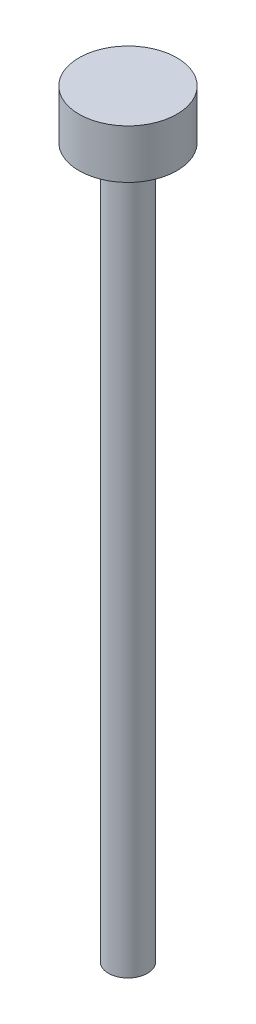
ISO-10303-21;
HEADER;
FILE_DESCRIPTION(('STEP AP214'),'2;1');
FILE_NAME('part.step','',(''),(''),'','','');
FILE_SCHEMA(('AUTOMOTIVE_DESIGN { 1 0 10303 214 1 1 1 1 }'));
ENDSEC;
DATA;
#1=APPLICATION_CONTEXT('core data for automotive mechanical design processes');
#2=APPLICATION_PROTOCOL_DEFINITION('international standard','automotive_design',2000,#1);
#3=PRODUCT_CONTEXT('',#1,'mechanical');
#4=PRODUCT('Part','Part','',(#3));
#5=PRODUCT_RELATED_PRODUCT_CATEGORY('part','',(#4));
#6=PRODUCT_DEFINITION_FORMATION('','',#4);
#7=PRODUCT_DEFINITION_CONTEXT('part definition',#1,'design');
#8=PRODUCT_DEFINITION('design','',#6,#7);
#9=PRODUCT_DEFINITION_SHAPE('','',#8);
#10=(LENGTH_UNIT() NAMED_UNIT(*) SI_UNIT(.MILLI.,.METRE.));
#11=(NAMED_UNIT(*) PLANE_ANGLE_UNIT() SI_UNIT($,.RADIAN.));
#12=(NAMED_UNIT(*) SI_UNIT($,.STERADIAN.) SOLID_ANGLE_UNIT());
#13=UNCERTAINTY_MEASURE_WITH_UNIT(LENGTH_MEASURE(1.E-05),#10,'distance_accuracy_value','');
#14=(GEOMETRIC_REPRESENTATION_CONTEXT(3) GLOBAL_UNCERTAINTY_ASSIGNED_CONTEXT((#13)) GLOBAL_UNIT_ASSIGNED_CONTEXT((#10,
#11,#12)) REPRESENTATION_CONTEXT('',''));
#15=CARTESIAN_POINT('',(0.,0.,0.));
#16=DIRECTION('',(0.,0.,1.));
#17=DIRECTION('',(1.,0.,0.));
#18=AXIS2_PLACEMENT_3D('',#15,#16,#17);
#19=CARTESIAN_POINT('',(0.,73.66,0.));
#20=DIRECTION('',(0.,-1.,0.));
#21=DIRECTION('',(0.,0.,-1.));
#22=AXIS2_PLACEMENT_3D('',#19,#20,#21);
#23=CYLINDRICAL_SURFACE('',#22,2.032);
#24=CARTESIAN_POINT('',(0.,73.66,0.));
#25=DIRECTION('',(0.,1.,0.));
#26=DIRECTION('',(0.,0.,1.));
#27=AXIS2_PLACEMENT_3D('',#24,#25,#26);
#28=CIRCLE('',#27,2.032);
#29=CARTESIAN_POINT('',(0.,73.66,2.032));
#30=VERTEX_POINT('',#29);
#31=EDGE_CURVE('E10',#30,#30,#28,.T.);
#32=ORIENTED_EDGE('',*,*,#31,.F.);
#33=EDGE_LOOP('',(#32));
#34=FACE_BOUND('',#33,.T.);
#35=CARTESIAN_POINT('',(0.,0.,0.));
#36=DIRECTION('',(0.,1.,0.));
#37=DIRECTION('',(0.,0.,1.));
#38=AXIS2_PLACEMENT_3D('',#35,#36,#37);
#39=CIRCLE('',#38,2.032);
#40=CARTESIAN_POINT('',(0.,0.,2.032));
#41=VERTEX_POINT('',#40);
#42=EDGE_CURVE('E34',#41,#41,#39,.T.);
#43=ORIENTED_EDGE('',*,*,#42,.T.);
#44=EDGE_LOOP('',(#43));
#45=FACE_BOUND('',#44,.T.);
#46=ADVANCED_FACE('F31',(#34,#45),#23,.T.);
#47=CARTESIAN_POINT('',(0.,0.,0.));
#48=DIRECTION('',(0.,1.,0.));
#49=DIRECTION('',(0.,0.,1.));
#50=AXIS2_PLACEMENT_3D('',#47,#48,#49);
#51=PLANE('',#50);
#52=ORIENTED_EDGE('',*,*,#42,.F.);
#53=EDGE_LOOP('',(#52));
#54=FACE_BOUND('',#53,.T.);
#55=ADVANCED_FACE('F59',(#54),#51,.F.);
#56=CARTESIAN_POINT('',(0.,73.66,0.));
#57=DIRECTION('',(0.,1.,0.));
#58=DIRECTION('',(0.,0.,1.));
#59=AXIS2_PLACEMENT_3D('',#56,#57,#58);
#60=PLANE('',#59);
#61=CARTESIAN_POINT('',(0.,73.66,0.));
#62=DIRECTION('',(0.,1.,0.));
#63=DIRECTION('',(0.,0.,1.));
#64=AXIS2_PLACEMENT_3D('',#61,#62,#63);
#65=CIRCLE('',#64,5.08);
#66=CARTESIAN_POINT('',(0.,73.66,5.08));
#67=VERTEX_POINT('',#66);
#68=EDGE_CURVE('E43',#67,#67,#65,.T.);
#69=ORIENTED_EDGE('',*,*,#68,.F.);
#70=EDGE_LOOP('',(#69));
#71=FACE_BOUND('',#70,.T.);
#72=ORIENTED_EDGE('',*,*,#31,.T.);
#73=EDGE_LOOP('',(#72));
#74=FACE_BOUND('',#73,.T.);
#75=ADVANCED_FACE('F54',(#71,#74),#60,.F.);
#76=CARTESIAN_POINT('',(0.,78.74,0.));
#77=DIRECTION('',(0.,-1.,0.));
#78=DIRECTION('',(0.,0.,-1.));
#79=AXIS2_PLACEMENT_3D('',#76,#77,#78);
#80=CYLINDRICAL_SURFACE('',#79,5.08);
#81=CARTESIAN_POINT('',(0.,78.74,0.));
#82=DIRECTION('',(0.,1.,0.));
#83=DIRECTION('',(0.,0.,1.));
#84=AXIS2_PLACEMENT_3D('',#81,#82,#83);
#85=CIRCLE('',#84,5.08);
#86=CARTESIAN_POINT('',(0.,78.74,5.08));
#87=VERTEX_POINT('',#86);
#88=EDGE_CURVE('E41',#87,#87,#85,.T.);
#89=ORIENTED_EDGE('',*,*,#88,.F.);
#90=EDGE_LOOP('',(#89));
#91=FACE_BOUND('',#90,.T.);
#92=ORIENTED_EDGE('',*,*,#68,.T.);
#93=EDGE_LOOP('',(#92));
#94=FACE_BOUND('',#93,.T.);
#95=ADVANCED_FACE('F51',(#91,#94),#80,.T.);
#96=CARTESIAN_POINT('',(0.,78.74,0.));
#97=DIRECTION('',(0.,1.,0.));
#98=DIRECTION('',(0.,0.,1.));
#99=AXIS2_PLACEMENT_3D('',#96,#97,#98);
#100=PLANE('',#99);
#101=ORIENTED_EDGE('',*,*,#88,.T.);
#102=EDGE_LOOP('',(#101));
#103=FACE_BOUND('',#102,.T.);
#104=ADVANCED_FACE('F49',(#103),#100,.T.);
#105=CLOSED_SHELL('',(#46,#55,#75,#95,#104));
#106=MANIFOLD_SOLID_BREP('B2',#105);
#107=ADVANCED_BREP_SHAPE_REPRESENTATION('',(#18,#106),#14);
#108=SHAPE_DEFINITION_REPRESENTATION(#9,#107);
ENDSEC;
END-ISO-10303-21;
